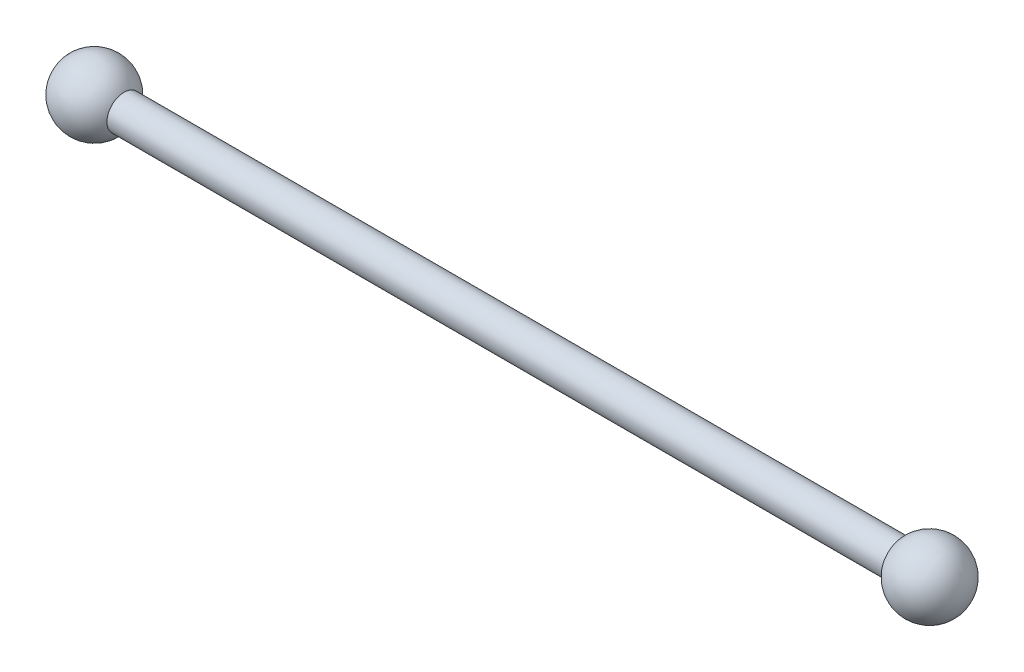
ISO-10303-21;
HEADER;
FILE_DESCRIPTION(('STEP AP214'),'2;1');
FILE_NAME('part.step','',(''),(''),'','','');
FILE_SCHEMA(('AUTOMOTIVE_DESIGN { 1 0 10303 214 1 1 1 1 }'));
ENDSEC;
DATA;
#1=APPLICATION_CONTEXT('core data for automotive mechanical design processes');
#2=APPLICATION_PROTOCOL_DEFINITION('international standard','automotive_design',2000,#1);
#3=PRODUCT_CONTEXT('',#1,'mechanical');
#4=PRODUCT('Part','Part','',(#3));
#5=PRODUCT_RELATED_PRODUCT_CATEGORY('part','',(#4));
#6=PRODUCT_DEFINITION_FORMATION('','',#4);
#7=PRODUCT_DEFINITION_CONTEXT('part definition',#1,'design');
#8=PRODUCT_DEFINITION('design','',#6,#7);
#9=PRODUCT_DEFINITION_SHAPE('','',#8);
#10=(LENGTH_UNIT() NAMED_UNIT(*) SI_UNIT(.MILLI.,.METRE.));
#11=(NAMED_UNIT(*) PLANE_ANGLE_UNIT() SI_UNIT($,.RADIAN.));
#12=(NAMED_UNIT(*) SI_UNIT($,.STERADIAN.) SOLID_ANGLE_UNIT());
#13=UNCERTAINTY_MEASURE_WITH_UNIT(LENGTH_MEASURE(1.E-05),#10,'distance_accuracy_value','');
#14=(GEOMETRIC_REPRESENTATION_CONTEXT(3) GLOBAL_UNCERTAINTY_ASSIGNED_CONTEXT((#13)) GLOBAL_UNIT_ASSIGNED_CONTEXT((#10,
#11,#12)) REPRESENTATION_CONTEXT('',''));
#15=CARTESIAN_POINT('',(0.,0.,0.));
#16=DIRECTION('',(0.,0.,1.));
#17=DIRECTION('',(1.,0.,0.));
#18=AXIS2_PLACEMENT_3D('',#15,#16,#17);
#19=CARTESIAN_POINT('',(19.25,-0.75,0.));
#20=DIRECTION('',(-1.,0.,0.));
#21=DIRECTION('',(0.,1.,0.));
#22=AXIS2_PLACEMENT_3D('',#19,#20,#21);
#23=SPHERICAL_SURFACE('',#22,3.);
#24=CARTESIAN_POINT('',(16.6519237886467,-0.75,0.));
#25=DIRECTION('',(-1.,0.,0.));
#26=DIRECTION('',(0.,0.,1.));
#27=AXIS2_PLACEMENT_3D('',#24,#25,#26);
#28=CIRCLE('',#27,1.5);
#29=CARTESIAN_POINT('',(16.6519237886467,-0.75,1.5));
#30=VERTEX_POINT('',#29);
#31=EDGE_CURVE('E10',#30,#30,#28,.T.);
#32=ORIENTED_EDGE('',*,*,#31,.F.);
#33=EDGE_LOOP('',(#32));
#34=FACE_BOUND('',#33,.T.);
#35=ADVANCED_FACE('F36',(#34),#23,.T.);
#36=CARTESIAN_POINT('',(-17.25,-0.75,0.));
#37=DIRECTION('',(-1.,0.,0.));
#38=DIRECTION('',(0.,0.,1.));
#39=AXIS2_PLACEMENT_3D('',#36,#37,#38);
#40=CYLINDRICAL_SURFACE('',#39,1.5);
#41=ORIENTED_EDGE('',*,*,#31,.T.);
#42=EDGE_LOOP('',(#41));
#43=FACE_BOUND('',#42,.T.);
#44=CARTESIAN_POINT('',(-51.1519237886467,-0.75,0.));
#45=DIRECTION('',(-1.,0.,0.));
#46=DIRECTION('',(0.,0.,1.));
#47=AXIS2_PLACEMENT_3D('',#44,#45,#46);
#48=CIRCLE('',#47,1.5);
#49=CARTESIAN_POINT('',(-51.1519237886467,-0.75,1.5));
#50=VERTEX_POINT('',#49);
#51=EDGE_CURVE('E42',#50,#50,#48,.T.);
#52=ORIENTED_EDGE('',*,*,#51,.F.);
#53=EDGE_LOOP('',(#52));
#54=FACE_BOUND('',#53,.T.);
#55=ADVANCED_FACE('F50',(#43,#54),#40,.T.);
#56=CARTESIAN_POINT('',(-53.75,-0.75,0.));
#57=DIRECTION('',(1.,0.,0.));
#58=DIRECTION('',(0.,1.,0.));
#59=AXIS2_PLACEMENT_3D('',#56,#57,#58);
#60=SPHERICAL_SURFACE('',#59,3.);
#61=ORIENTED_EDGE('',*,*,#51,.T.);
#62=EDGE_LOOP('',(#61));
#63=FACE_BOUND('',#62,.T.);
#64=ADVANCED_FACE('F48',(#63),#60,.T.);
#65=CLOSED_SHELL('',(#35,#55,#64));
#66=MANIFOLD_SOLID_BREP('B2',#65);
#67=ADVANCED_BREP_SHAPE_REPRESENTATION('',(#18,#66),#14);
#68=SHAPE_DEFINITION_REPRESENTATION(#9,#67);
ENDSEC;
END-ISO-10303-21;
